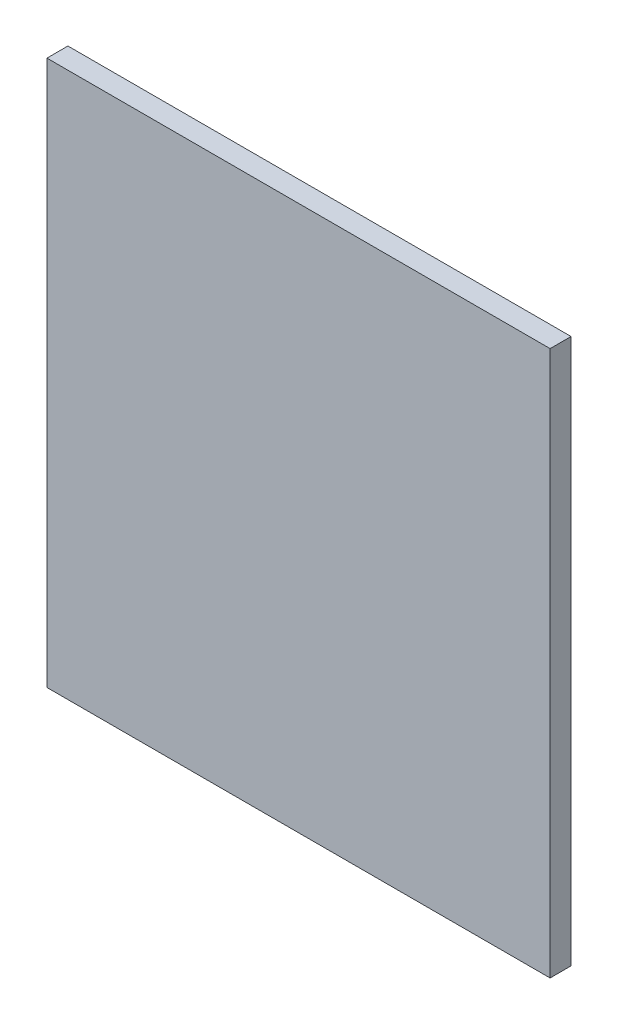
ISO-10303-21;
HEADER;
FILE_DESCRIPTION(('STEP AP214'),'2;1');
FILE_NAME('part.step','',(''),(''),'','','');
FILE_SCHEMA(('AUTOMOTIVE_DESIGN { 1 0 10303 214 1 1 1 1 }'));
ENDSEC;
DATA;
#1=APPLICATION_CONTEXT('core data for automotive mechanical design processes');
#2=APPLICATION_PROTOCOL_DEFINITION('international standard','automotive_design',2000,#1);
#3=PRODUCT_CONTEXT('',#1,'mechanical');
#4=PRODUCT('Part','Part','',(#3));
#5=PRODUCT_RELATED_PRODUCT_CATEGORY('part','',(#4));
#6=PRODUCT_DEFINITION_FORMATION('','',#4);
#7=PRODUCT_DEFINITION_CONTEXT('part definition',#1,'design');
#8=PRODUCT_DEFINITION('design','',#6,#7);
#9=PRODUCT_DEFINITION_SHAPE('','',#8);
#10=(LENGTH_UNIT() NAMED_UNIT(*) SI_UNIT(.MILLI.,.METRE.));
#11=(NAMED_UNIT(*) PLANE_ANGLE_UNIT() SI_UNIT($,.RADIAN.));
#12=(NAMED_UNIT(*) SI_UNIT($,.STERADIAN.) SOLID_ANGLE_UNIT());
#13=UNCERTAINTY_MEASURE_WITH_UNIT(LENGTH_MEASURE(1.E-05),#10,'distance_accuracy_value','');
#14=(GEOMETRIC_REPRESENTATION_CONTEXT(3) GLOBAL_UNCERTAINTY_ASSIGNED_CONTEXT((#13)) GLOBAL_UNIT_ASSIGNED_CONTEXT((#10,
#11,#12)) REPRESENTATION_CONTEXT('',''));
#15=CARTESIAN_POINT('',(0.,0.,0.));
#16=DIRECTION('',(0.,0.,1.));
#17=DIRECTION('',(1.,0.,0.));
#18=AXIS2_PLACEMENT_3D('',#15,#16,#17);
#19=CARTESIAN_POINT('',(6.,6.5,0.5));
#20=DIRECTION('',(-1.,0.,0.));
#21=DIRECTION('',(0.,-1.,0.));
#22=AXIS2_PLACEMENT_3D('',#19,#20,#21);
#23=PLANE('',#22);
#24=DIRECTION('',(0.,1.,0.));
#25=VECTOR('',#24,1.);
#26=CARTESIAN_POINT('',(6.,6.5,0.));
#27=LINE('',#26,#25);
#28=CARTESIAN_POINT('',(6.,-6.5,0.));
#29=VERTEX_POINT('',#28);
#30=CARTESIAN_POINT('',(6.,6.5,0.));
#31=VERTEX_POINT('',#30);
#32=EDGE_CURVE('E97',#29,#31,#27,.T.);
#33=ORIENTED_EDGE('',*,*,#32,.T.);
#34=DIRECTION('',(0.,0.,-1.));
#35=VECTOR('',#34,1.);
#36=CARTESIAN_POINT('',(6.,6.5,0.5));
#37=LINE('',#36,#35);
#38=CARTESIAN_POINT('',(6.,6.5,0.5));
#39=VERTEX_POINT('',#38);
#40=EDGE_CURVE('E11',#39,#31,#37,.T.);
#41=ORIENTED_EDGE('',*,*,#40,.F.);
#42=DIRECTION('',(0.,1.,0.));
#43=VECTOR('',#42,1.);
#44=CARTESIAN_POINT('',(6.,6.5,0.5));
#45=LINE('',#44,#43);
#46=CARTESIAN_POINT('',(6.,-6.5,0.5));
#47=VERTEX_POINT('',#46);
#48=EDGE_CURVE('E85',#47,#39,#45,.T.);
#49=ORIENTED_EDGE('',*,*,#48,.F.);
#50=DIRECTION('',(0.,0.,-1.));
#51=VECTOR('',#50,1.);
#52=CARTESIAN_POINT('',(6.,-6.5,0.5));
#53=LINE('',#52,#51);
#54=EDGE_CURVE('E93',#47,#29,#53,.T.);
#55=ORIENTED_EDGE('',*,*,#54,.T.);
#56=EDGE_LOOP('',(#33,#41,#49,#55));
#57=FACE_BOUND('',#56,.T.);
#58=ADVANCED_FACE('F34',(#57),#23,.F.);
#59=CARTESIAN_POINT('',(-6.,6.5,0.5));
#60=DIRECTION('',(0.,-1.,0.));
#61=DIRECTION('',(0.,0.,-1.));
#62=AXIS2_PLACEMENT_3D('',#59,#60,#61);
#63=PLANE('',#62);
#64=DIRECTION('',(-1.,0.,0.));
#65=VECTOR('',#64,1.);
#66=CARTESIAN_POINT('',(-6.,6.5,0.));
#67=LINE('',#66,#65);
#68=CARTESIAN_POINT('',(-6.,6.5,0.));
#69=VERTEX_POINT('',#68);
#70=EDGE_CURVE('E89',#31,#69,#67,.T.);
#71=ORIENTED_EDGE('',*,*,#70,.T.);
#72=DIRECTION('',(0.,0.,-1.));
#73=VECTOR('',#72,1.);
#74=CARTESIAN_POINT('',(-6.,6.5,0.5));
#75=LINE('',#74,#73);
#76=CARTESIAN_POINT('',(-6.,6.5,0.5));
#77=VERTEX_POINT('',#76);
#78=EDGE_CURVE('E42',#77,#69,#75,.T.);
#79=ORIENTED_EDGE('',*,*,#78,.F.);
#80=DIRECTION('',(-1.,0.,0.));
#81=VECTOR('',#80,1.);
#82=CARTESIAN_POINT('',(-6.,6.5,0.5));
#83=LINE('',#82,#81);
#84=EDGE_CURVE('E80',#39,#77,#83,.T.);
#85=ORIENTED_EDGE('',*,*,#84,.F.);
#86=ORIENTED_EDGE('',*,*,#40,.T.);
#87=EDGE_LOOP('',(#71,#79,#85,#86));
#88=FACE_BOUND('',#87,.T.);
#89=ADVANCED_FACE('F88',(#88),#63,.F.);
#90=CARTESIAN_POINT('',(-6.,6.5,0.5));
#91=DIRECTION('',(1.,0.,0.));
#92=DIRECTION('',(0.,1.,0.));
#93=AXIS2_PLACEMENT_3D('',#90,#91,#92);
#94=PLANE('',#93);
#95=DIRECTION('',(0.,-1.,0.));
#96=VECTOR('',#95,1.);
#97=CARTESIAN_POINT('',(-6.,6.5,0.));
#98=LINE('',#97,#96);
#99=CARTESIAN_POINT('',(-6.,-6.5,0.));
#100=VERTEX_POINT('',#99);
#101=EDGE_CURVE('E67',#69,#100,#98,.T.);
#102=ORIENTED_EDGE('',*,*,#101,.T.);
#103=DIRECTION('',(0.,0.,-1.));
#104=VECTOR('',#103,1.);
#105=CARTESIAN_POINT('',(-6.,-6.5,0.5));
#106=LINE('',#105,#104);
#107=CARTESIAN_POINT('',(-6.,-6.5,0.5));
#108=VERTEX_POINT('',#107);
#109=EDGE_CURVE('E90',#108,#100,#106,.T.);
#110=ORIENTED_EDGE('',*,*,#109,.F.);
#111=DIRECTION('',(0.,-1.,0.));
#112=VECTOR('',#111,1.);
#113=CARTESIAN_POINT('',(-6.,6.5,0.5));
#114=LINE('',#113,#112);
#115=EDGE_CURVE('E83',#77,#108,#114,.T.);
#116=ORIENTED_EDGE('',*,*,#115,.F.);
#117=ORIENTED_EDGE('',*,*,#78,.T.);
#118=EDGE_LOOP('',(#102,#110,#116,#117));
#119=FACE_BOUND('',#118,.T.);
#120=ADVANCED_FACE('F91',(#119),#94,.F.);
#121=CARTESIAN_POINT('',(-6.,-6.5,0.5));
#122=DIRECTION('',(0.,1.,0.));
#123=DIRECTION('',(0.,0.,1.));
#124=AXIS2_PLACEMENT_3D('',#121,#122,#123);
#125=PLANE('',#124);
#126=DIRECTION('',(1.,0.,0.));
#127=VECTOR('',#126,1.);
#128=CARTESIAN_POINT('',(-6.,-6.5,0.));
#129=LINE('',#128,#127);
#130=EDGE_CURVE('E73',#100,#29,#129,.T.);
#131=ORIENTED_EDGE('',*,*,#130,.T.);
#132=ORIENTED_EDGE('',*,*,#54,.F.);
#133=DIRECTION('',(1.,0.,0.));
#134=VECTOR('',#133,1.);
#135=CARTESIAN_POINT('',(-6.,-6.5,0.5));
#136=LINE('',#135,#134);
#137=EDGE_CURVE('E50',#108,#47,#136,.T.);
#138=ORIENTED_EDGE('',*,*,#137,.F.);
#139=ORIENTED_EDGE('',*,*,#109,.T.);
#140=EDGE_LOOP('',(#131,#132,#138,#139));
#141=FACE_BOUND('',#140,.T.);
#142=ADVANCED_FACE('F104',(#141),#125,.F.);
#143=CARTESIAN_POINT('',(0.,0.,0.5));
#144=DIRECTION('',(0.,0.,1.));
#145=DIRECTION('',(1.,0.,0.));
#146=AXIS2_PLACEMENT_3D('',#143,#144,#145);
#147=PLANE('',#146);
#148=ORIENTED_EDGE('',*,*,#48,.T.);
#149=ORIENTED_EDGE('',*,*,#84,.T.);
#150=ORIENTED_EDGE('',*,*,#115,.T.);
#151=ORIENTED_EDGE('',*,*,#137,.T.);
#152=EDGE_LOOP('',(#148,#149,#150,#151));
#153=FACE_BOUND('',#152,.T.);
#154=ADVANCED_FACE('F81',(#153),#147,.T.);
#155=CARTESIAN_POINT('',(0.,0.,0.));
#156=DIRECTION('',(0.,0.,1.));
#157=DIRECTION('',(1.,0.,0.));
#158=AXIS2_PLACEMENT_3D('',#155,#156,#157);
#159=PLANE('',#158);
#160=ORIENTED_EDGE('',*,*,#32,.F.);
#161=ORIENTED_EDGE('',*,*,#130,.F.);
#162=ORIENTED_EDGE('',*,*,#101,.F.);
#163=ORIENTED_EDGE('',*,*,#70,.F.);
#164=EDGE_LOOP('',(#160,#161,#162,#163));
#165=FACE_BOUND('',#164,.T.);
#166=ADVANCED_FACE('F107',(#165),#159,.F.);
#167=CLOSED_SHELL('',(#58,#89,#120,#142,#154,#166));
#168=MANIFOLD_SOLID_BREP('B2',#167);
#169=ADVANCED_BREP_SHAPE_REPRESENTATION('',(#18,#168),#14);
#170=SHAPE_DEFINITION_REPRESENTATION(#9,#169);
ENDSEC;
END-ISO-10303-21;
